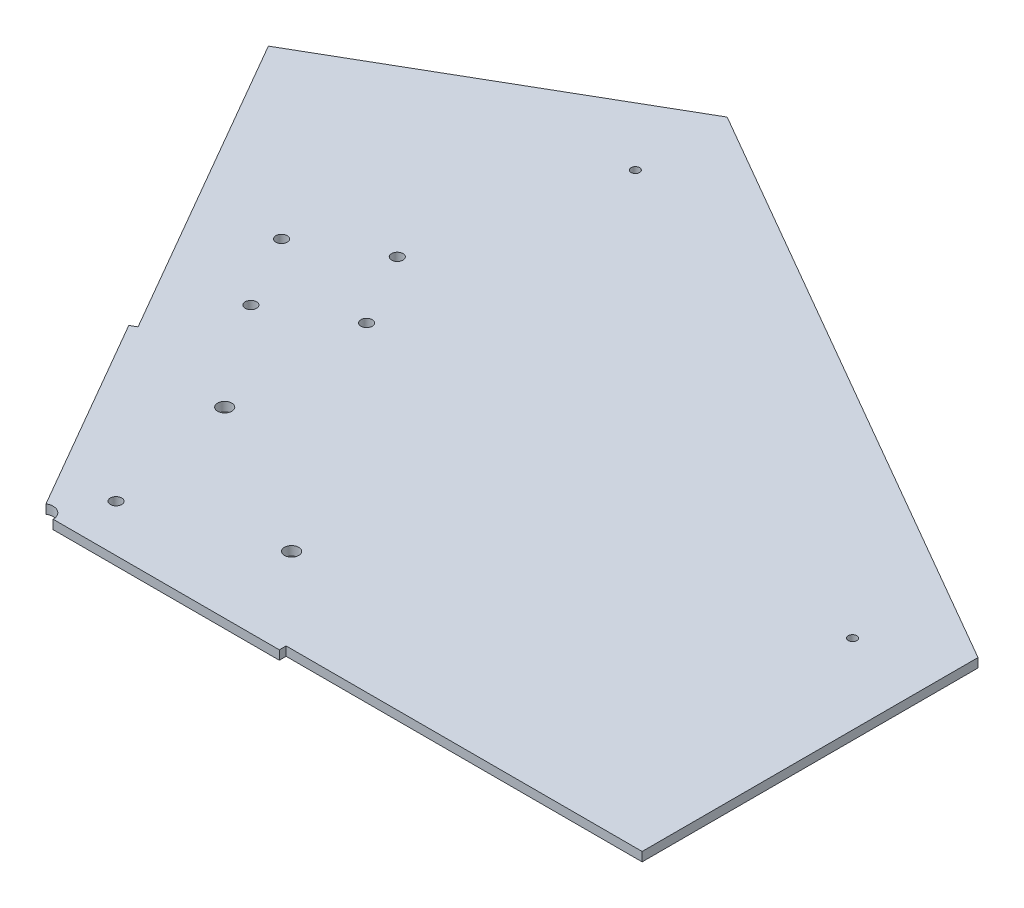
ISO-10303-21;
HEADER;
FILE_DESCRIPTION(('STEP AP214'),'2;1');
FILE_NAME('part.step','',(''),(''),'','','');
FILE_SCHEMA(('AUTOMOTIVE_DESIGN { 1 0 10303 214 1 1 1 1 }'));
ENDSEC;
DATA;
#1=APPLICATION_CONTEXT('core data for automotive mechanical design processes');
#2=APPLICATION_PROTOCOL_DEFINITION('international standard','automotive_design',2000,#1);
#3=PRODUCT_CONTEXT('',#1,'mechanical');
#4=PRODUCT('Part','Part','',(#3));
#5=PRODUCT_RELATED_PRODUCT_CATEGORY('part','',(#4));
#6=PRODUCT_DEFINITION_FORMATION('','',#4);
#7=PRODUCT_DEFINITION_CONTEXT('part definition',#1,'design');
#8=PRODUCT_DEFINITION('design','',#6,#7);
#9=PRODUCT_DEFINITION_SHAPE('','',#8);
#10=(LENGTH_UNIT() NAMED_UNIT(*) SI_UNIT(.MILLI.,.METRE.));
#11=(NAMED_UNIT(*) PLANE_ANGLE_UNIT() SI_UNIT($,.RADIAN.));
#12=(NAMED_UNIT(*) SI_UNIT($,.STERADIAN.) SOLID_ANGLE_UNIT());
#13=UNCERTAINTY_MEASURE_WITH_UNIT(LENGTH_MEASURE(1.E-05),#10,'distance_accuracy_value','');
#14=(GEOMETRIC_REPRESENTATION_CONTEXT(3) GLOBAL_UNCERTAINTY_ASSIGNED_CONTEXT((#13)) GLOBAL_UNIT_ASSIGNED_CONTEXT((#10,
#11,#12)) REPRESENTATION_CONTEXT('',''));
#15=CARTESIAN_POINT('',(0.,0.,0.));
#16=DIRECTION('',(0.,0.,1.));
#17=DIRECTION('',(1.,0.,0.));
#18=AXIS2_PLACEMENT_3D('',#15,#16,#17);
#19=CARTESIAN_POINT('',(208.182271536748,3.175,120.194090512249));
#20=DIRECTION('',(-1.,0.,0.));
#21=DIRECTION('',(0.,0.,1.));
#22=AXIS2_PLACEMENT_3D('',#19,#20,#21);
#23=PLANE('',#22);
#24=DIRECTION('',(0.,1.,0.));
#25=VECTOR('',#24,1.);
#26=CARTESIAN_POINT('',(208.182271536748,0.,-2.38125));
#27=LINE('',#26,#25);
#28=CARTESIAN_POINT('',(208.182271536748,0.,-2.38125));
#29=VERTEX_POINT('',#28);
#30=CARTESIAN_POINT('',(208.182271536748,3.175,-2.38125));
#31=VERTEX_POINT('',#30);
#32=EDGE_CURVE('E194',#29,#31,#27,.T.);
#33=ORIENTED_EDGE('',*,*,#32,.F.);
#34=DIRECTION('',(0.,0.,-1.));
#35=VECTOR('',#34,1.);
#36=CARTESIAN_POINT('',(208.182271536748,0.,120.194090512249));
#37=LINE('',#36,#35);
#38=CARTESIAN_POINT('',(208.182271536748,0.,-120.19409051225));
#39=VERTEX_POINT('',#38);
#40=EDGE_CURVE('E210',#29,#39,#37,.T.);
#41=ORIENTED_EDGE('',*,*,#40,.T.);
#42=DIRECTION('',(0.,-1.,0.));
#43=VECTOR('',#42,1.);
#44=CARTESIAN_POINT('',(208.182271536748,3.175,-120.19409051225));
#45=LINE('',#44,#43);
#46=CARTESIAN_POINT('',(208.182271536748,3.175,-120.19409051225));
#47=VERTEX_POINT('',#46);
#48=EDGE_CURVE('E229',#47,#39,#45,.T.);
#49=ORIENTED_EDGE('',*,*,#48,.F.);
#50=DIRECTION('',(0.,0.,-1.));
#51=VECTOR('',#50,1.);
#52=CARTESIAN_POINT('',(208.182271536748,3.175,120.194090512249));
#53=LINE('',#52,#51);
#54=EDGE_CURVE('E213',#31,#47,#53,.T.);
#55=ORIENTED_EDGE('',*,*,#54,.F.);
#56=EDGE_LOOP('',(#33,#41,#49,#55));
#57=FACE_BOUND('',#56,.T.);
#58=ADVANCED_FACE('F84',(#57),#23,.F.);
#59=CARTESIAN_POINT('',(0.,3.175,0.));
#60=DIRECTION('',(0.,1.,0.));
#61=DIRECTION('',(0.,0.,1.));
#62=AXIS2_PLACEMENT_3D('',#59,#60,#61);
#63=PLANE('',#62);
#64=DIRECTION('',(-0.500000000000004,0.,-0.866025403784436));
#65=VECTOR('',#64,1.);
#66=CARTESIAN_POINT('',(0.,3.175,0.));
#67=LINE('',#66,#65);
#68=CARTESIAN_POINT('',(-1.98437500000002,3.175,-3.43703832126948));
#69=VERTEX_POINT('',#68);
#70=CARTESIAN_POINT('',(-41.6500000000004,3.175,-72.1399161352436));
#71=VERTEX_POINT('',#70);
#72=EDGE_CURVE('E177',#69,#71,#67,.T.);
#73=ORIENTED_EDGE('',*,*,#72,.F.);
#74=CARTESIAN_POINT('',(0.,3.175,0.));
#75=DIRECTION('',(0.,1.,0.));
#76=DIRECTION('',(0.,0.,1.));
#77=AXIS2_PLACEMENT_3D('',#74,#75,#76);
#78=CIRCLE('',#77,3.96875);
#79=CARTESIAN_POINT('',(3.96875,3.175,0.));
#80=VERTEX_POINT('',#79);
#81=EDGE_CURVE('E176',#80,#69,#78,.T.);
#82=ORIENTED_EDGE('',*,*,#81,.F.);
#83=DIRECTION('',(-1.,0.,0.));
#84=VECTOR('',#83,1.);
#85=CARTESIAN_POINT('',(0.,3.175,0.));
#86=LINE('',#85,#84);
#87=CARTESIAN_POINT('',(83.3000000000001,3.175,0.));
#88=VERTEX_POINT('',#87);
#89=EDGE_CURVE('E98',#88,#80,#86,.T.);
#90=ORIENTED_EDGE('',*,*,#89,.F.);
#91=DIRECTION('',(0.,0.,1.));
#92=VECTOR('',#91,1.);
#93=CARTESIAN_POINT('',(83.3000000000001,3.175,-2.38125));
#94=LINE('',#93,#92);
#95=CARTESIAN_POINT('',(83.3000000000001,3.175,-2.38125));
#96=VERTEX_POINT('',#95);
#97=EDGE_CURVE('E174',#96,#88,#94,.T.);
#98=ORIENTED_EDGE('',*,*,#97,.F.);
#99=DIRECTION('',(1.,0.,0.));
#100=VECTOR('',#99,1.);
#101=CARTESIAN_POINT('',(83.3000000000001,3.175,-2.38125));
#102=LINE('',#101,#100);
#103=EDGE_CURVE('E183',#96,#31,#102,.T.);
#104=ORIENTED_EDGE('',*,*,#103,.T.);
#105=ORIENTED_EDGE('',*,*,#54,.T.);
#106=DIRECTION('',(-0.866025403784439,0.,-0.5));
#107=VECTOR('',#106,1.);
#108=CARTESIAN_POINT('',(208.182271536748,3.175,-120.19409051225));
#109=LINE('',#108,#107);
#110=CARTESIAN_POINT('',(0.,3.175,-240.388181024499));
#111=VERTEX_POINT('',#110);
#112=EDGE_CURVE('E215',#47,#111,#109,.T.);
#113=ORIENTED_EDGE('',*,*,#112,.T.);
#114=DIRECTION('',(-0.866025403784439,0.,0.5));
#115=VECTOR('',#114,1.);
#116=CARTESIAN_POINT('',(0.,3.175,-240.388181024499));
#117=LINE('',#116,#115);
#118=CARTESIAN_POINT('',(-102.028912775613,3.175,-181.481760768374));
#119=VERTEX_POINT('',#118);
#120=EDGE_CURVE('E218',#111,#119,#117,.T.);
#121=ORIENTED_EDGE('',*,*,#120,.T.);
#122=DIRECTION('',(-0.500000000000001,0.,-0.866025403784438));
#123=VECTOR('',#122,1.);
#124=CARTESIAN_POINT('',(2.06222299276171,3.175,-1.19062500000001));
#125=LINE('',#124,#123);
#126=CARTESIAN_POINT('',(-39.5877770072384,3.175,-73.3305411352438));
#127=VERTEX_POINT('',#126);
#128=EDGE_CURVE('E199',#127,#119,#125,.T.);
#129=ORIENTED_EDGE('',*,*,#128,.F.);
#130=DIRECTION('',(0.866025403784439,0.,-0.5));
#131=VECTOR('',#130,1.);
#132=CARTESIAN_POINT('',(-41.6500000000001,3.175,-72.1399161352438));
#133=LINE('',#132,#131);
#134=EDGE_CURVE('E203',#71,#127,#133,.T.);
#135=ORIENTED_EDGE('',*,*,#134,.F.);
#136=EDGE_LOOP('',(#73,#82,#90,#98,#104,#105,#113,#121,#129,#135));
#137=FACE_BOUND('',#136,.T.);
#138=CARTESIAN_POINT('',(2.4980018054066E-12,3.175,-208.182271536748));
#139=DIRECTION('',(0.,1.,0.));
#140=DIRECTION('',(0.,0.,1.));
#141=AXIS2_PLACEMENT_3D('',#138,#139,#140);
#142=CIRCLE('',#141,1.50000000000003);
#143=CARTESIAN_POINT('',(2.4980018054066E-12,3.175,-206.682271536748));
#144=VERTEX_POINT('',#143);
#145=EDGE_CURVE('E246',#144,#144,#142,.T.);
#146=ORIENTED_EDGE('',*,*,#145,.F.);
#147=EDGE_LOOP('',(#146));
#148=FACE_BOUND('',#147,.T.);
#149=CARTESIAN_POINT('',(180.291135768374,3.175,-104.091135768374));
#150=DIRECTION('',(0.,1.,0.));
#151=DIRECTION('',(0.,0.,1.));
#152=AXIS2_PLACEMENT_3D('',#149,#150,#151);
#153=CIRCLE('',#152,1.5);
#154=CARTESIAN_POINT('',(180.291135768374,3.175,-102.591135768374));
#155=VERTEX_POINT('',#154);
#156=EDGE_CURVE('E249',#155,#155,#153,.T.);
#157=ORIENTED_EDGE('',*,*,#156,.F.);
#158=EDGE_LOOP('',(#157));
#159=FACE_BOUND('',#158,.T.);
#160=CARTESIAN_POINT('',(-2.5989001450899E-13,3.175,-64.13373));
#161=DIRECTION('',(0.,1.,0.));
#162=DIRECTION('',(0.,0.,1.));
#163=AXIS2_PLACEMENT_3D('',#160,#161,#162);
#164=CIRCLE('',#163,2.50000000000001);
#165=CARTESIAN_POINT('',(-2.5989001450899E-13,3.175,-61.63373));
#166=VERTEX_POINT('',#165);
#167=EDGE_CURVE('E264',#166,#166,#164,.T.);
#168=ORIENTED_EDGE('',*,*,#167,.F.);
#169=EDGE_LOOP('',(#168));
#170=FACE_BOUND('',#169,.T.);
#171=CARTESIAN_POINT('',(55.541439419452,3.175,-32.0668650000003));
#172=DIRECTION('',(0.,1.,0.));
#173=DIRECTION('',(0.,0.,1.));
#174=AXIS2_PLACEMENT_3D('',#171,#172,#173);
#175=CIRCLE('',#174,2.5);
#176=CARTESIAN_POINT('',(55.541439419452,3.175,-29.5668650000003));
#177=VERTEX_POINT('',#176);
#178=EDGE_CURVE('E258',#177,#177,#175,.T.);
#179=ORIENTED_EDGE('',*,*,#178,.F.);
#180=EDGE_LOOP('',(#179));
#181=FACE_BOUND('',#180,.T.);
#182=CARTESIAN_POINT('',(9.52499999999996,3.175,-16.4977839420936));
#183=DIRECTION('',(0.,1.,0.));
#184=DIRECTION('',(0.,0.,1.));
#185=AXIS2_PLACEMENT_3D('',#182,#183,#184);
#186=CIRCLE('',#185,2.);
#187=CARTESIAN_POINT('',(9.52499999999996,3.175,-14.4977839420936));
#188=VERTEX_POINT('',#187);
#189=EDGE_CURVE('E267',#188,#188,#186,.T.);
#190=ORIENTED_EDGE('',*,*,#189,.F.);
#191=EDGE_LOOP('',(#190));
#192=FACE_BOUND('',#191,.T.);
#193=CARTESIAN_POINT('',(-0.691596465701592,3.175,-114.60888021693));
#194=DIRECTION('',(0.,1.,0.));
#195=DIRECTION('',(0.,0.,1.));
#196=AXIS2_PLACEMENT_3D('',#193,#194,#195);
#197=CIRCLE('',#196,2.00000000000001);
#198=CARTESIAN_POINT('',(-0.691596465701592,3.175,-112.60888021693));
#199=VERTEX_POINT('',#198);
#200=EDGE_CURVE('E284',#199,#199,#197,.T.);
#201=ORIENTED_EDGE('',*,*,#200,.F.);
#202=EDGE_LOOP('',(#201));
#203=FACE_BOUND('',#202,.T.);
#204=CARTESIAN_POINT('',(-15.3915964657016,3.175,-140.070027088193));
#205=DIRECTION('',(0.,1.,0.));
#206=DIRECTION('',(0.,0.,1.));
#207=AXIS2_PLACEMENT_3D('',#204,#205,#206);
#208=CIRCLE('',#207,2.00000000000001);
#209=CARTESIAN_POINT('',(-15.3915964657016,3.175,-138.070027088193));
#210=VERTEX_POINT('',#209);
#211=EDGE_CURVE('E278',#210,#210,#208,.T.);
#212=ORIENTED_EDGE('',*,*,#211,.F.);
#213=EDGE_LOOP('',(#212));
#214=FACE_BOUND('',#213,.T.);
#215=CARTESIAN_POINT('',(-26.4281394153675,3.175,-99.7498802169302));
#216=DIRECTION('',(0.,1.,0.));
#217=DIRECTION('',(0.,0.,1.));
#218=AXIS2_PLACEMENT_3D('',#215,#216,#217);
#219=CIRCLE('',#218,2.);
#220=CARTESIAN_POINT('',(-26.4281394153675,3.175,-97.7498802169302));
#221=VERTEX_POINT('',#220);
#222=EDGE_CURVE('E186',#221,#221,#219,.T.);
#223=ORIENTED_EDGE('',*,*,#222,.F.);
#224=EDGE_LOOP('',(#223));
#225=FACE_BOUND('',#224,.T.);
#226=CARTESIAN_POINT('',(-41.1281394153676,3.175,-125.211027088193));
#227=DIRECTION('',(0.,1.,0.));
#228=DIRECTION('',(0.,0.,1.));
#229=AXIS2_PLACEMENT_3D('',#226,#227,#228);
#230=CIRCLE('',#229,2.00000000000001);
#231=CARTESIAN_POINT('',(-41.1281394153676,3.175,-123.211027088193));
#232=VERTEX_POINT('',#231);
#233=EDGE_CURVE('E205',#232,#232,#230,.T.);
#234=ORIENTED_EDGE('',*,*,#233,.F.);
#235=EDGE_LOOP('',(#234));
#236=FACE_BOUND('',#235,.T.);
#237=ADVANCED_FACE('F171',(#137,#148,#159,#170,#181,#192,#203,#214,#225,#236),#63,.T.);
#238=CARTESIAN_POINT('',(0.,0.,0.));
#239=DIRECTION('',(0.,1.,0.));
#240=DIRECTION('',(0.,0.,1.));
#241=AXIS2_PLACEMENT_3D('',#238,#239,#240);
#242=PLANE('',#241);
#243=CARTESIAN_POINT('',(2.4980018054066E-12,0.,-208.182271536748));
#244=DIRECTION('',(0.,1.,0.));
#245=DIRECTION('',(0.,0.,1.));
#246=AXIS2_PLACEMENT_3D('',#243,#244,#245);
#247=CIRCLE('',#246,1.50000000000003);
#248=CARTESIAN_POINT('',(2.4980018054066E-12,0.,-206.682271536748));
#249=VERTEX_POINT('',#248);
#250=EDGE_CURVE('E245',#249,#249,#247,.T.);
#251=ORIENTED_EDGE('',*,*,#250,.T.);
#252=EDGE_LOOP('',(#251));
#253=FACE_BOUND('',#252,.T.);
#254=CARTESIAN_POINT('',(180.291135768374,0.,-104.091135768374));
#255=DIRECTION('',(0.,1.,0.));
#256=DIRECTION('',(0.,0.,1.));
#257=AXIS2_PLACEMENT_3D('',#254,#255,#256);
#258=CIRCLE('',#257,1.5);
#259=CARTESIAN_POINT('',(180.291135768374,0.,-102.591135768374));
#260=VERTEX_POINT('',#259);
#261=EDGE_CURVE('E252',#260,#260,#258,.T.);
#262=ORIENTED_EDGE('',*,*,#261,.T.);
#263=EDGE_LOOP('',(#262));
#264=FACE_BOUND('',#263,.T.);
#265=CARTESIAN_POINT('',(-2.5989001450899E-13,0.,-64.13373));
#266=DIRECTION('',(0.,1.,0.));
#267=DIRECTION('',(0.,0.,1.));
#268=AXIS2_PLACEMENT_3D('',#265,#266,#267);
#269=CIRCLE('',#268,2.50000000000001);
#270=CARTESIAN_POINT('',(-2.5989001450899E-13,0.,-61.63373));
#271=VERTEX_POINT('',#270);
#272=EDGE_CURVE('E261',#271,#271,#269,.T.);
#273=ORIENTED_EDGE('',*,*,#272,.T.);
#274=EDGE_LOOP('',(#273));
#275=FACE_BOUND('',#274,.T.);
#276=CARTESIAN_POINT('',(55.541439419452,0.,-32.0668650000003));
#277=DIRECTION('',(0.,1.,0.));
#278=DIRECTION('',(0.,0.,1.));
#279=AXIS2_PLACEMENT_3D('',#276,#277,#278);
#280=CIRCLE('',#279,2.5);
#281=CARTESIAN_POINT('',(55.541439419452,0.,-29.5668650000003));
#282=VERTEX_POINT('',#281);
#283=EDGE_CURVE('E255',#282,#282,#280,.T.);
#284=ORIENTED_EDGE('',*,*,#283,.T.);
#285=EDGE_LOOP('',(#284));
#286=FACE_BOUND('',#285,.T.);
#287=CARTESIAN_POINT('',(9.52499999999996,0.,-16.4977839420936));
#288=DIRECTION('',(0.,1.,0.));
#289=DIRECTION('',(0.,0.,1.));
#290=AXIS2_PLACEMENT_3D('',#287,#288,#289);
#291=CIRCLE('',#290,2.);
#292=CARTESIAN_POINT('',(9.52499999999996,0.,-14.4977839420936));
#293=VERTEX_POINT('',#292);
#294=EDGE_CURVE('E270',#293,#293,#291,.T.);
#295=ORIENTED_EDGE('',*,*,#294,.T.);
#296=EDGE_LOOP('',(#295));
#297=FACE_BOUND('',#296,.T.);
#298=CARTESIAN_POINT('',(-26.4281394153675,0.,-99.7498802169302));
#299=DIRECTION('',(0.,1.,0.));
#300=DIRECTION('',(0.,0.,1.));
#301=AXIS2_PLACEMENT_3D('',#298,#299,#300);
#302=CIRCLE('',#301,2.);
#303=CARTESIAN_POINT('',(-26.4281394153675,0.,-97.7498802169302));
#304=VERTEX_POINT('',#303);
#305=EDGE_CURVE('E182',#304,#304,#302,.T.);
#306=ORIENTED_EDGE('',*,*,#305,.T.);
#307=EDGE_LOOP('',(#306));
#308=FACE_BOUND('',#307,.T.);
#309=CARTESIAN_POINT('',(-41.1281394153676,0.,-125.211027088193));
#310=DIRECTION('',(0.,1.,0.));
#311=DIRECTION('',(0.,0.,1.));
#312=AXIS2_PLACEMENT_3D('',#309,#310,#311);
#313=CIRCLE('',#312,2.00000000000001);
#314=CARTESIAN_POINT('',(-41.1281394153676,0.,-123.211027088193));
#315=VERTEX_POINT('',#314);
#316=EDGE_CURVE('E291',#315,#315,#313,.T.);
#317=ORIENTED_EDGE('',*,*,#316,.T.);
#318=EDGE_LOOP('',(#317));
#319=FACE_BOUND('',#318,.T.);
#320=CARTESIAN_POINT('',(-15.3915964657016,0.,-140.070027088193));
#321=DIRECTION('',(0.,1.,0.));
#322=DIRECTION('',(0.,0.,1.));
#323=AXIS2_PLACEMENT_3D('',#320,#321,#322);
#324=CIRCLE('',#323,2.00000000000001);
#325=CARTESIAN_POINT('',(-15.3915964657016,0.,-138.070027088193));
#326=VERTEX_POINT('',#325);
#327=EDGE_CURVE('E281',#326,#326,#324,.T.);
#328=ORIENTED_EDGE('',*,*,#327,.T.);
#329=EDGE_LOOP('',(#328));
#330=FACE_BOUND('',#329,.T.);
#331=CARTESIAN_POINT('',(-0.691596465701592,0.,-114.60888021693));
#332=DIRECTION('',(0.,1.,0.));
#333=DIRECTION('',(0.,0.,1.));
#334=AXIS2_PLACEMENT_3D('',#331,#332,#333);
#335=CIRCLE('',#334,2.00000000000001);
#336=CARTESIAN_POINT('',(-0.691596465701592,0.,-112.60888021693));
#337=VERTEX_POINT('',#336);
#338=EDGE_CURVE('E276',#337,#337,#335,.T.);
#339=ORIENTED_EDGE('',*,*,#338,.T.);
#340=EDGE_LOOP('',(#339));
#341=FACE_BOUND('',#340,.T.);
#342=CARTESIAN_POINT('',(0.,0.,0.));
#343=DIRECTION('',(0.,1.,0.));
#344=DIRECTION('',(0.,0.,1.));
#345=AXIS2_PLACEMENT_3D('',#342,#343,#344);
#346=CIRCLE('',#345,3.96875);
#347=CARTESIAN_POINT('',(3.96875,0.,0.));
#348=VERTEX_POINT('',#347);
#349=CARTESIAN_POINT('',(-1.98437500000002,0.,-3.43703832126948));
#350=VERTEX_POINT('',#349);
#351=EDGE_CURVE('E235',#348,#350,#346,.T.);
#352=ORIENTED_EDGE('',*,*,#351,.T.);
#353=DIRECTION('',(-0.500000000000004,0.,-0.866025403784436));
#354=VECTOR('',#353,1.);
#355=CARTESIAN_POINT('',(0.,0.,0.));
#356=LINE('',#355,#354);
#357=CARTESIAN_POINT('',(-41.6500000000004,0.,-72.1399161352436));
#358=VERTEX_POINT('',#357);
#359=EDGE_CURVE('E106',#350,#358,#356,.T.);
#360=ORIENTED_EDGE('',*,*,#359,.T.);
#361=DIRECTION('',(0.866025403784439,0.,-0.5));
#362=VECTOR('',#361,1.);
#363=CARTESIAN_POINT('',(-41.6500000000001,0.,-72.1399161352438));
#364=LINE('',#363,#362);
#365=CARTESIAN_POINT('',(-39.5877770072384,0.,-73.3305411352438));
#366=VERTEX_POINT('',#365);
#367=EDGE_CURVE('E196',#358,#366,#364,.T.);
#368=ORIENTED_EDGE('',*,*,#367,.T.);
#369=DIRECTION('',(-0.500000000000001,0.,-0.866025403784438));
#370=VECTOR('',#369,1.);
#371=CARTESIAN_POINT('',(2.06222299276171,0.,-1.19062500000001));
#372=LINE('',#371,#370);
#373=CARTESIAN_POINT('',(-102.028912775613,0.,-181.481760768374));
#374=VERTEX_POINT('',#373);
#375=EDGE_CURVE('E198',#366,#374,#372,.T.);
#376=ORIENTED_EDGE('',*,*,#375,.T.);
#377=DIRECTION('',(-0.866025403784439,0.,0.5));
#378=VECTOR('',#377,1.);
#379=CARTESIAN_POINT('',(0.,0.,-240.388181024499));
#380=LINE('',#379,#378);
#381=CARTESIAN_POINT('',(0.,0.,-240.388181024499));
#382=VERTEX_POINT('',#381);
#383=EDGE_CURVE('E216',#382,#374,#380,.T.);
#384=ORIENTED_EDGE('',*,*,#383,.F.);
#385=DIRECTION('',(-0.866025403784439,0.,-0.5));
#386=VECTOR('',#385,1.);
#387=CARTESIAN_POINT('',(208.182271536748,0.,-120.19409051225));
#388=LINE('',#387,#386);
#389=EDGE_CURVE('E223',#39,#382,#388,.T.);
#390=ORIENTED_EDGE('',*,*,#389,.F.);
#391=ORIENTED_EDGE('',*,*,#40,.F.);
#392=DIRECTION('',(1.,0.,0.));
#393=VECTOR('',#392,1.);
#394=CARTESIAN_POINT('',(83.3000000000001,0.,-2.38125));
#395=LINE('',#394,#393);
#396=CARTESIAN_POINT('',(83.3000000000001,0.,-2.38125));
#397=VERTEX_POINT('',#396);
#398=EDGE_CURVE('E192',#397,#29,#395,.T.);
#399=ORIENTED_EDGE('',*,*,#398,.F.);
#400=DIRECTION('',(0.,0.,1.));
#401=VECTOR('',#400,1.);
#402=CARTESIAN_POINT('',(83.3000000000001,0.,-2.38125));
#403=LINE('',#402,#401);
#404=CARTESIAN_POINT('',(83.3000000000001,0.,0.));
#405=VERTEX_POINT('',#404);
#406=EDGE_CURVE('E188',#397,#405,#403,.T.);
#407=ORIENTED_EDGE('',*,*,#406,.T.);
#408=DIRECTION('',(-1.,0.,0.));
#409=VECTOR('',#408,1.);
#410=CARTESIAN_POINT('',(0.,0.,0.));
#411=LINE('',#410,#409);
#412=EDGE_CURVE('E160',#405,#348,#411,.T.);
#413=ORIENTED_EDGE('',*,*,#412,.T.);
#414=EDGE_LOOP('',(#352,#360,#368,#376,#384,#390,#391,#399,#407,#413));
#415=FACE_BOUND('',#414,.T.);
#416=ADVANCED_FACE('F237',(#253,#264,#275,#286,#297,#308,#319,#330,#341,#415),#242,.F.);
#417=CARTESIAN_POINT('',(208.182271536748,3.175,-120.19409051225));
#418=DIRECTION('',(-0.5,0.,0.866025403784439));
#419=DIRECTION('',(0.866025403784439,0.,0.5));
#420=AXIS2_PLACEMENT_3D('',#417,#418,#419);
#421=PLANE('',#420);
#422=ORIENTED_EDGE('',*,*,#389,.T.);
#423=DIRECTION('',(0.,-1.,0.));
#424=VECTOR('',#423,1.);
#425=CARTESIAN_POINT('',(0.,3.175,-240.388181024499));
#426=LINE('',#425,#424);
#427=EDGE_CURVE('E221',#111,#382,#426,.T.);
#428=ORIENTED_EDGE('',*,*,#427,.F.);
#429=ORIENTED_EDGE('',*,*,#112,.F.);
#430=ORIENTED_EDGE('',*,*,#48,.T.);
#431=EDGE_LOOP('',(#422,#428,#429,#430));
#432=FACE_BOUND('',#431,.T.);
#433=ADVANCED_FACE('F307',(#432),#421,.F.);
#434=CARTESIAN_POINT('',(0.,3.175,-240.388181024499));
#435=DIRECTION('',(0.5,0.,0.866025403784439));
#436=DIRECTION('',(0.866025403784439,0.,-0.5));
#437=AXIS2_PLACEMENT_3D('',#434,#435,#436);
#438=PLANE('',#437);
#439=ORIENTED_EDGE('',*,*,#383,.T.);
#440=DIRECTION('',(0.,1.,0.));
#441=VECTOR('',#440,1.);
#442=CARTESIAN_POINT('',(-102.028912775613,0.,-181.481760768374));
#443=LINE('',#442,#441);
#444=EDGE_CURVE('E207',#374,#119,#443,.T.);
#445=ORIENTED_EDGE('',*,*,#444,.T.);
#446=ORIENTED_EDGE('',*,*,#120,.F.);
#447=ORIENTED_EDGE('',*,*,#427,.T.);
#448=EDGE_LOOP('',(#439,#445,#446,#447));
#449=FACE_BOUND('',#448,.T.);
#450=ADVANCED_FACE('F312',(#449),#438,.F.);
#451=CARTESIAN_POINT('',(2.06222299276171,0.,-1.19062500000001));
#452=DIRECTION('',(0.866025403784438,0.,-0.5));
#453=DIRECTION('',(-0.500000000000001,0.,-0.866025403784438));
#454=AXIS2_PLACEMENT_3D('',#451,#452,#453);
#455=PLANE('',#454);
#456=ORIENTED_EDGE('',*,*,#128,.T.);
#457=ORIENTED_EDGE('',*,*,#444,.F.);
#458=ORIENTED_EDGE('',*,*,#375,.F.);
#459=DIRECTION('',(0.,1.,0.));
#460=VECTOR('',#459,1.);
#461=CARTESIAN_POINT('',(-39.5877770072384,0.,-73.3305411352438));
#462=LINE('',#461,#460);
#463=EDGE_CURVE('E202',#366,#127,#462,.T.);
#464=ORIENTED_EDGE('',*,*,#463,.T.);
#465=EDGE_LOOP('',(#456,#457,#458,#464));
#466=FACE_BOUND('',#465,.T.);
#467=ADVANCED_FACE('F316',(#466),#455,.F.);
#468=CARTESIAN_POINT('',(-41.6500000000001,0.,-72.1399161352438));
#469=DIRECTION('',(0.5,0.,0.866025403784439));
#470=DIRECTION('',(0.866025403784439,0.,-0.5));
#471=AXIS2_PLACEMENT_3D('',#468,#469,#470);
#472=PLANE('',#471);
#473=ORIENTED_EDGE('',*,*,#367,.F.);
#474=DIRECTION('',(0.,1.,0.));
#475=VECTOR('',#474,1.);
#476=CARTESIAN_POINT('',(-41.6500000000001,0.,-72.1399161352438));
#477=LINE('',#476,#475);
#478=EDGE_CURVE('E165',#358,#71,#477,.T.);
#479=ORIENTED_EDGE('',*,*,#478,.T.);
#480=ORIENTED_EDGE('',*,*,#134,.T.);
#481=ORIENTED_EDGE('',*,*,#463,.F.);
#482=EDGE_LOOP('',(#473,#479,#480,#481));
#483=FACE_BOUND('',#482,.T.);
#484=ADVANCED_FACE('F320',(#483),#472,.F.);
#485=CARTESIAN_POINT('',(-41.1281394153676,0.,-125.211027088193));
#486=DIRECTION('',(0.,1.,0.));
#487=DIRECTION('',(0.,0.,1.));
#488=AXIS2_PLACEMENT_3D('',#485,#486,#487);
#489=CYLINDRICAL_SURFACE('',#488,2.00000000000001);
#490=ORIENTED_EDGE('',*,*,#316,.F.);
#491=EDGE_LOOP('',(#490));
#492=FACE_BOUND('',#491,.T.);
#493=ORIENTED_EDGE('',*,*,#233,.T.);
#494=EDGE_LOOP('',(#493));
#495=FACE_BOUND('',#494,.T.);
#496=ADVANCED_FACE('F364',(#492,#495),#489,.F.);
#497=CARTESIAN_POINT('',(-26.4281394153675,0.,-99.7498802169302));
#498=DIRECTION('',(0.,1.,0.));
#499=DIRECTION('',(0.,0.,1.));
#500=AXIS2_PLACEMENT_3D('',#497,#498,#499);
#501=CYLINDRICAL_SURFACE('',#500,2.);
#502=ORIENTED_EDGE('',*,*,#305,.F.);
#503=EDGE_LOOP('',(#502));
#504=FACE_BOUND('',#503,.T.);
#505=ORIENTED_EDGE('',*,*,#222,.T.);
#506=EDGE_LOOP('',(#505));
#507=FACE_BOUND('',#506,.T.);
#508=ADVANCED_FACE('F370',(#504,#507),#501,.F.);
#509=CARTESIAN_POINT('',(83.3000000000001,0.,-2.38125));
#510=DIRECTION('',(-1.,0.,0.));
#511=DIRECTION('',(0.,0.,1.));
#512=AXIS2_PLACEMENT_3D('',#509,#510,#511);
#513=PLANE('',#512);
#514=ORIENTED_EDGE('',*,*,#97,.T.);
#515=DIRECTION('',(0.,-1.,0.));
#516=VECTOR('',#515,1.);
#517=CARTESIAN_POINT('',(83.3000000000001,0.,0.));
#518=LINE('',#517,#516);
#519=EDGE_CURVE('E157',#88,#405,#518,.T.);
#520=ORIENTED_EDGE('',*,*,#519,.T.);
#521=ORIENTED_EDGE('',*,*,#406,.F.);
#522=DIRECTION('',(0.,1.,0.));
#523=VECTOR('',#522,1.);
#524=CARTESIAN_POINT('',(83.3000000000001,0.,-2.38125));
#525=LINE('',#524,#523);
#526=EDGE_CURVE('E180',#397,#96,#525,.T.);
#527=ORIENTED_EDGE('',*,*,#526,.T.);
#528=EDGE_LOOP('',(#514,#520,#521,#527));
#529=FACE_BOUND('',#528,.T.);
#530=ADVANCED_FACE('F179',(#529),#513,.F.);
#531=CARTESIAN_POINT('',(83.3000000000001,0.,-2.38125));
#532=DIRECTION('',(0.,0.,1.));
#533=DIRECTION('',(1.,0.,0.));
#534=AXIS2_PLACEMENT_3D('',#531,#532,#533);
#535=PLANE('',#534);
#536=ORIENTED_EDGE('',*,*,#103,.F.);
#537=ORIENTED_EDGE('',*,*,#526,.F.);
#538=ORIENTED_EDGE('',*,*,#398,.T.);
#539=ORIENTED_EDGE('',*,*,#32,.T.);
#540=EDGE_LOOP('',(#536,#537,#538,#539));
#541=FACE_BOUND('',#540,.T.);
#542=ADVANCED_FACE('F298',(#541),#535,.T.);
#543=CARTESIAN_POINT('',(-15.3915964657016,0.,-140.070027088193));
#544=DIRECTION('',(0.,1.,0.));
#545=DIRECTION('',(0.,0.,1.));
#546=AXIS2_PLACEMENT_3D('',#543,#544,#545);
#547=CYLINDRICAL_SURFACE('',#546,2.00000000000001);
#548=ORIENTED_EDGE('',*,*,#327,.F.);
#549=EDGE_LOOP('',(#548));
#550=FACE_BOUND('',#549,.T.);
#551=ORIENTED_EDGE('',*,*,#211,.T.);
#552=EDGE_LOOP('',(#551));
#553=FACE_BOUND('',#552,.T.);
#554=ADVANCED_FACE('F391',(#550,#553),#547,.F.);
#555=CARTESIAN_POINT('',(-0.691596465701592,0.,-114.60888021693));
#556=DIRECTION('',(0.,1.,0.));
#557=DIRECTION('',(0.,0.,1.));
#558=AXIS2_PLACEMENT_3D('',#555,#556,#557);
#559=CYLINDRICAL_SURFACE('',#558,2.00000000000001);
#560=ORIENTED_EDGE('',*,*,#338,.F.);
#561=EDGE_LOOP('',(#560));
#562=FACE_BOUND('',#561,.T.);
#563=ORIENTED_EDGE('',*,*,#200,.T.);
#564=EDGE_LOOP('',(#563));
#565=FACE_BOUND('',#564,.T.);
#566=ADVANCED_FACE('F398',(#562,#565),#559,.F.);
#567=CARTESIAN_POINT('',(0.,0.,0.));
#568=DIRECTION('',(0.,1.,0.));
#569=DIRECTION('',(0.,0.,1.));
#570=AXIS2_PLACEMENT_3D('',#567,#568,#569);
#571=CYLINDRICAL_SURFACE('',#570,3.96875);
#572=ORIENTED_EDGE('',*,*,#81,.T.);
#573=DIRECTION('',(0.,1.,0.));
#574=VECTOR('',#573,1.);
#575=CARTESIAN_POINT('',(-1.98437500000002,0.,-3.43703832126948));
#576=LINE('',#575,#574);
#577=EDGE_CURVE('E12',#69,#350,#576,.F.);
#578=ORIENTED_EDGE('',*,*,#577,.T.);
#579=ORIENTED_EDGE('',*,*,#351,.F.);
#580=DIRECTION('',(0.,1.,0.));
#581=VECTOR('',#580,1.);
#582=CARTESIAN_POINT('',(3.96875,0.,0.));
#583=LINE('',#582,#581);
#584=EDGE_CURVE('E91',#348,#80,#583,.T.);
#585=ORIENTED_EDGE('',*,*,#584,.T.);
#586=EDGE_LOOP('',(#572,#578,#579,#585));
#587=FACE_BOUND('',#586,.T.);
#588=ADVANCED_FACE('F233',(#587),#571,.F.);
#589=CARTESIAN_POINT('',(9.52499999999996,0.,-16.4977839420936));
#590=DIRECTION('',(0.,1.,0.));
#591=DIRECTION('',(0.,0.,1.));
#592=AXIS2_PLACEMENT_3D('',#589,#590,#591);
#593=CYLINDRICAL_SURFACE('',#592,2.);
#594=ORIENTED_EDGE('',*,*,#294,.F.);
#595=EDGE_LOOP('',(#594));
#596=FACE_BOUND('',#595,.T.);
#597=ORIENTED_EDGE('',*,*,#189,.T.);
#598=EDGE_LOOP('',(#597));
#599=FACE_BOUND('',#598,.T.);
#600=ADVANCED_FACE('F413',(#596,#599),#593,.F.);
#601=CARTESIAN_POINT('',(55.541439419452,0.,-32.0668650000003));
#602=DIRECTION('',(0.,1.,0.));
#603=DIRECTION('',(0.,0.,1.));
#604=AXIS2_PLACEMENT_3D('',#601,#602,#603);
#605=CYLINDRICAL_SURFACE('',#604,2.5);
#606=ORIENTED_EDGE('',*,*,#283,.F.);
#607=EDGE_LOOP('',(#606));
#608=FACE_BOUND('',#607,.T.);
#609=ORIENTED_EDGE('',*,*,#178,.T.);
#610=EDGE_LOOP('',(#609));
#611=FACE_BOUND('',#610,.T.);
#612=ADVANCED_FACE('F420',(#608,#611),#605,.F.);
#613=CARTESIAN_POINT('',(-2.5989001450899E-13,0.,-64.13373));
#614=DIRECTION('',(0.,1.,0.));
#615=DIRECTION('',(0.,0.,1.));
#616=AXIS2_PLACEMENT_3D('',#613,#614,#615);
#617=CYLINDRICAL_SURFACE('',#616,2.50000000000001);
#618=ORIENTED_EDGE('',*,*,#272,.F.);
#619=EDGE_LOOP('',(#618));
#620=FACE_BOUND('',#619,.T.);
#621=ORIENTED_EDGE('',*,*,#167,.T.);
#622=EDGE_LOOP('',(#621));
#623=FACE_BOUND('',#622,.T.);
#624=ADVANCED_FACE('F428',(#620,#623),#617,.F.);
#625=CARTESIAN_POINT('',(180.291135768374,0.,-104.091135768374));
#626=DIRECTION('',(0.,1.,0.));
#627=DIRECTION('',(0.,0.,1.));
#628=AXIS2_PLACEMENT_3D('',#625,#626,#627);
#629=CYLINDRICAL_SURFACE('',#628,1.5);
#630=ORIENTED_EDGE('',*,*,#261,.F.);
#631=EDGE_LOOP('',(#630));
#632=FACE_BOUND('',#631,.T.);
#633=ORIENTED_EDGE('',*,*,#156,.T.);
#634=EDGE_LOOP('',(#633));
#635=FACE_BOUND('',#634,.T.);
#636=ADVANCED_FACE('F436',(#632,#635),#629,.F.);
#637=CARTESIAN_POINT('',(2.4980018054066E-12,0.,-208.182271536748));
#638=DIRECTION('',(0.,1.,0.));
#639=DIRECTION('',(0.,0.,1.));
#640=AXIS2_PLACEMENT_3D('',#637,#638,#639);
#641=CYLINDRICAL_SURFACE('',#640,1.50000000000003);
#642=ORIENTED_EDGE('',*,*,#250,.F.);
#643=EDGE_LOOP('',(#642));
#644=FACE_BOUND('',#643,.T.);
#645=ORIENTED_EDGE('',*,*,#145,.T.);
#646=EDGE_LOOP('',(#645));
#647=FACE_BOUND('',#646,.T.);
#648=ADVANCED_FACE('F327',(#644,#647),#641,.F.);
#649=CARTESIAN_POINT('',(0.,0.,0.));
#650=DIRECTION('',(0.,0.,-1.));
#651=DIRECTION('',(-1.,0.,0.));
#652=AXIS2_PLACEMENT_3D('',#649,#650,#651);
#653=PLANE('',#652);
#654=ORIENTED_EDGE('',*,*,#89,.T.);
#655=ORIENTED_EDGE('',*,*,#584,.F.);
#656=ORIENTED_EDGE('',*,*,#412,.F.);
#657=ORIENTED_EDGE('',*,*,#519,.F.);
#658=EDGE_LOOP('',(#654,#655,#656,#657));
#659=FACE_BOUND('',#658,.T.);
#660=ADVANCED_FACE('F158',(#659),#653,.F.);
#661=CARTESIAN_POINT('',(0.,0.,0.));
#662=DIRECTION('',(0.866025403784436,0.,-0.500000000000004));
#663=DIRECTION('',(-0.500000000000004,0.,-0.866025403784436));
#664=AXIS2_PLACEMENT_3D('',#661,#662,#663);
#665=PLANE('',#664);
#666=ORIENTED_EDGE('',*,*,#359,.F.);
#667=ORIENTED_EDGE('',*,*,#577,.F.);
#668=ORIENTED_EDGE('',*,*,#72,.T.);
#669=ORIENTED_EDGE('',*,*,#478,.F.);
#670=EDGE_LOOP('',(#666,#667,#668,#669));
#671=FACE_BOUND('',#670,.T.);
#672=ADVANCED_FACE('F321',(#671),#665,.F.);
#673=CLOSED_SHELL('',(#58,#237,#416,#433,#450,#467,#484,#496,#508,#530,#542,#554,#566,#588,#600,
#612,#624,#636,#648,#660,#672));
#674=MANIFOLD_SOLID_BREP('B2',#673);
#675=ADVANCED_BREP_SHAPE_REPRESENTATION('',(#18,#674),#14);
#676=SHAPE_DEFINITION_REPRESENTATION(#9,#675);
ENDSEC;
END-ISO-10303-21;
